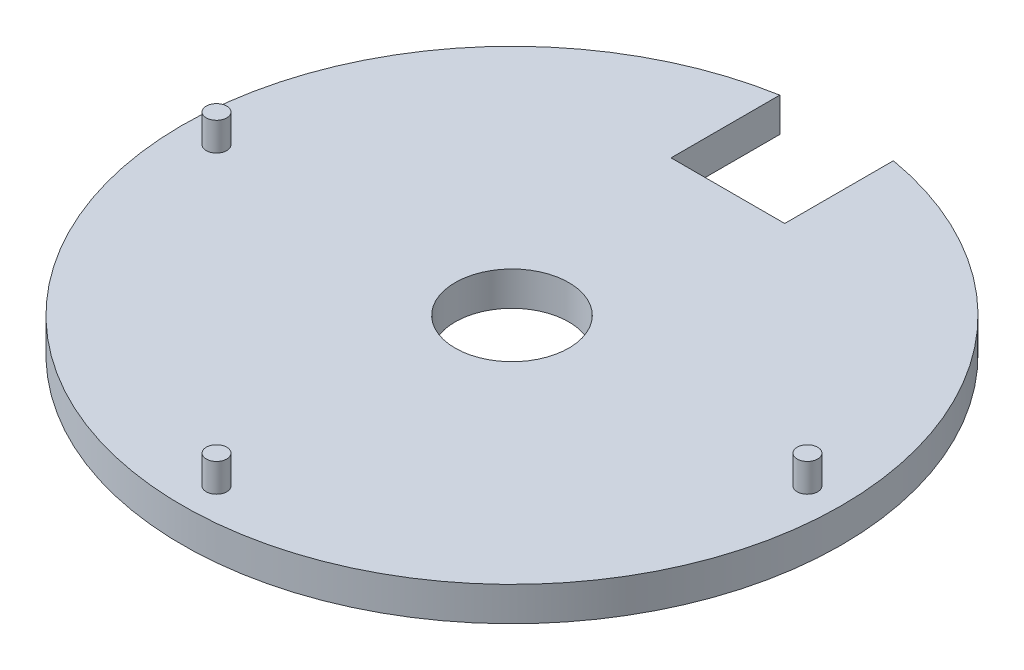
ISO-10303-21;
HEADER;
FILE_DESCRIPTION(('STEP AP214'),'2;1');
FILE_NAME('part.step','',(''),(''),'','','');
FILE_SCHEMA(('AUTOMOTIVE_DESIGN { 1 0 10303 214 1 1 1 1 }'));
ENDSEC;
DATA;
#1=APPLICATION_CONTEXT('core data for automotive mechanical design processes');
#2=APPLICATION_PROTOCOL_DEFINITION('international standard','automotive_design',2000,#1);
#3=PRODUCT_CONTEXT('',#1,'mechanical');
#4=PRODUCT('Part','Part','',(#3));
#5=PRODUCT_RELATED_PRODUCT_CATEGORY('part','',(#4));
#6=PRODUCT_DEFINITION_FORMATION('','',#4);
#7=PRODUCT_DEFINITION_CONTEXT('part definition',#1,'design');
#8=PRODUCT_DEFINITION('design','',#6,#7);
#9=PRODUCT_DEFINITION_SHAPE('','',#8);
#10=(LENGTH_UNIT() NAMED_UNIT(*) SI_UNIT(.MILLI.,.METRE.));
#11=(NAMED_UNIT(*) PLANE_ANGLE_UNIT() SI_UNIT($,.RADIAN.));
#12=(NAMED_UNIT(*) SI_UNIT($,.STERADIAN.) SOLID_ANGLE_UNIT());
#13=UNCERTAINTY_MEASURE_WITH_UNIT(LENGTH_MEASURE(1.E-05),#10,'distance_accuracy_value','');
#14=(GEOMETRIC_REPRESENTATION_CONTEXT(3) GLOBAL_UNCERTAINTY_ASSIGNED_CONTEXT((#13)) GLOBAL_UNIT_ASSIGNED_CONTEXT((#10,
#11,#12)) REPRESENTATION_CONTEXT('',''));
#15=CARTESIAN_POINT('',(0.,0.,0.));
#16=DIRECTION('',(0.,0.,1.));
#17=DIRECTION('',(1.,0.,0.));
#18=AXIS2_PLACEMENT_3D('',#15,#16,#17);
#19=CARTESIAN_POINT('',(0.,3.,0.));
#20=DIRECTION('',(0.,-1.,0.));
#21=DIRECTION('',(0.,0.,-1.));
#22=AXIS2_PLACEMENT_3D('',#19,#20,#21);
#23=CYLINDRICAL_SURFACE('',#22,29.);
#24=CARTESIAN_POINT('',(0.,0.,0.));
#25=DIRECTION('',(0.,1.,0.));
#26=DIRECTION('',(0.,0.,1.));
#27=AXIS2_PLACEMENT_3D('',#24,#25,#26);
#28=CIRCLE('',#27,29.);
#29=CARTESIAN_POINT('',(-5.,0.,-28.5657137141714));
#30=VERTEX_POINT('',#29);
#31=CARTESIAN_POINT('',(5.,0.,-28.5657137141714));
#32=VERTEX_POINT('',#31);
#33=EDGE_CURVE('E122',#30,#32,#28,.T.);
#34=ORIENTED_EDGE('',*,*,#33,.T.);
#35=DIRECTION('',(0.,-1.,0.));
#36=VECTOR('',#35,1.);
#37=CARTESIAN_POINT('',(5.,3.,-28.5657137141714));
#38=LINE('',#37,#36);
#39=CARTESIAN_POINT('',(5.,3.,-28.5657137141714));
#40=VERTEX_POINT('',#39);
#41=EDGE_CURVE('E57',#32,#40,#38,.F.);
#42=ORIENTED_EDGE('',*,*,#41,.T.);
#43=CARTESIAN_POINT('',(0.,3.,0.));
#44=DIRECTION('',(0.,1.,0.));
#45=DIRECTION('',(0.,0.,1.));
#46=AXIS2_PLACEMENT_3D('',#43,#44,#45);
#47=CIRCLE('',#46,29.);
#48=CARTESIAN_POINT('',(-5.,3.,-28.5657137141714));
#49=VERTEX_POINT('',#48);
#50=EDGE_CURVE('E125',#49,#40,#47,.T.);
#51=ORIENTED_EDGE('',*,*,#50,.F.);
#52=DIRECTION('',(0.,-1.,0.));
#53=VECTOR('',#52,1.);
#54=CARTESIAN_POINT('',(-5.,3.,-28.5657137141714));
#55=LINE('',#54,#53);
#56=EDGE_CURVE('E87',#49,#30,#55,.T.);
#57=ORIENTED_EDGE('',*,*,#56,.T.);
#58=EDGE_LOOP('',(#34,#42,#51,#57));
#59=FACE_BOUND('',#58,.T.);
#60=ADVANCED_FACE('F35',(#59),#23,.T.);
#61=CARTESIAN_POINT('',(0.,3.,0.));
#62=DIRECTION('',(0.,1.,0.));
#63=DIRECTION('',(0.,0.,1.));
#64=AXIS2_PLACEMENT_3D('',#61,#62,#63);
#65=PLANE('',#64);
#66=DIRECTION('',(0.,0.,-1.));
#67=VECTOR('',#66,1.);
#68=CARTESIAN_POINT('',(5.,3.,-29.));
#69=LINE('',#68,#67);
#70=CARTESIAN_POINT('',(5.,3.,-19.));
#71=VERTEX_POINT('',#70);
#72=EDGE_CURVE('E81',#71,#40,#69,.T.);
#73=ORIENTED_EDGE('',*,*,#72,.F.);
#74=DIRECTION('',(1.,0.,0.));
#75=VECTOR('',#74,1.);
#76=CARTESIAN_POINT('',(5.,3.,-19.));
#77=LINE('',#76,#75);
#78=CARTESIAN_POINT('',(-5.,3.,-19.));
#79=VERTEX_POINT('',#78);
#80=EDGE_CURVE('E76',#79,#71,#77,.T.);
#81=ORIENTED_EDGE('',*,*,#80,.F.);
#82=DIRECTION('',(0.,0.,1.));
#83=VECTOR('',#82,1.);
#84=CARTESIAN_POINT('',(-5.,3.,-19.));
#85=LINE('',#84,#83);
#86=EDGE_CURVE('E84',#49,#79,#85,.T.);
#87=ORIENTED_EDGE('',*,*,#86,.F.);
#88=ORIENTED_EDGE('',*,*,#50,.T.);
#89=EDGE_LOOP('',(#73,#81,#87,#88));
#90=FACE_BOUND('',#89,.T.);
#91=CARTESIAN_POINT('',(0.,3.,0.));
#92=DIRECTION('',(0.,1.,0.));
#93=DIRECTION('',(0.,0.,1.));
#94=AXIS2_PLACEMENT_3D('',#91,#92,#93);
#95=CIRCLE('',#94,5.);
#96=CARTESIAN_POINT('',(0.,3.,5.));
#97=VERTEX_POINT('',#96);
#98=EDGE_CURVE('E100',#97,#97,#95,.T.);
#99=ORIENTED_EDGE('',*,*,#98,.F.);
#100=EDGE_LOOP('',(#99));
#101=FACE_BOUND('',#100,.T.);
#102=CARTESIAN_POINT('',(0.,3.,26.));
#103=DIRECTION('',(0.,1.,0.));
#104=DIRECTION('',(0.,0.,1.));
#105=AXIS2_PLACEMENT_3D('',#102,#103,#104);
#106=CIRCLE('',#105,0.9);
#107=CARTESIAN_POINT('',(0.,3.,26.9));
#108=VERTEX_POINT('',#107);
#109=EDGE_CURVE('E104',#108,#108,#106,.T.);
#110=ORIENTED_EDGE('',*,*,#109,.F.);
#111=EDGE_LOOP('',(#110));
#112=FACE_BOUND('',#111,.T.);
#113=CARTESIAN_POINT('',(26.,3.,0.));
#114=DIRECTION('',(0.,1.,0.));
#115=DIRECTION('',(0.,0.,1.));
#116=AXIS2_PLACEMENT_3D('',#113,#114,#115);
#117=CIRCLE('',#116,0.9);
#118=CARTESIAN_POINT('',(26.,3.,0.9));
#119=VERTEX_POINT('',#118);
#120=EDGE_CURVE('E113',#119,#119,#117,.T.);
#121=ORIENTED_EDGE('',*,*,#120,.F.);
#122=EDGE_LOOP('',(#121));
#123=FACE_BOUND('',#122,.T.);
#124=CARTESIAN_POINT('',(-26.,3.,0.));
#125=DIRECTION('',(0.,1.,0.));
#126=DIRECTION('',(0.,0.,1.));
#127=AXIS2_PLACEMENT_3D('',#124,#125,#126);
#128=CIRCLE('',#127,0.9);
#129=CARTESIAN_POINT('',(-26.,3.,0.900000000000004));
#130=VERTEX_POINT('',#129);
#131=EDGE_CURVE('E116',#130,#130,#128,.T.);
#132=ORIENTED_EDGE('',*,*,#131,.F.);
#133=EDGE_LOOP('',(#132));
#134=FACE_BOUND('',#133,.T.);
#135=ADVANCED_FACE('F92',(#90,#101,#112,#123,#134),#65,.T.);
#136=CARTESIAN_POINT('',(0.,0.,0.));
#137=DIRECTION('',(0.,1.,0.));
#138=DIRECTION('',(0.,0.,1.));
#139=AXIS2_PLACEMENT_3D('',#136,#137,#138);
#140=PLANE('',#139);
#141=CARTESIAN_POINT('',(0.,0.,0.));
#142=DIRECTION('',(0.,1.,0.));
#143=DIRECTION('',(0.,0.,1.));
#144=AXIS2_PLACEMENT_3D('',#141,#142,#143);
#145=CIRCLE('',#144,5.);
#146=CARTESIAN_POINT('',(0.,0.,5.));
#147=VERTEX_POINT('',#146);
#148=EDGE_CURVE('E101',#147,#147,#145,.T.);
#149=ORIENTED_EDGE('',*,*,#148,.T.);
#150=EDGE_LOOP('',(#149));
#151=FACE_BOUND('',#150,.T.);
#152=DIRECTION('',(1.,0.,0.));
#153=VECTOR('',#152,1.);
#154=CARTESIAN_POINT('',(0.,0.,-19.));
#155=LINE('',#154,#153);
#156=CARTESIAN_POINT('',(-5.,0.,-19.));
#157=VERTEX_POINT('',#156);
#158=CARTESIAN_POINT('',(5.,0.,-19.));
#159=VERTEX_POINT('',#158);
#160=EDGE_CURVE('E42',#157,#159,#155,.T.);
#161=ORIENTED_EDGE('',*,*,#160,.T.);
#162=DIRECTION('',(0.,0.,-1.));
#163=VECTOR('',#162,1.);
#164=CARTESIAN_POINT('',(5.,0.,0.));
#165=LINE('',#164,#163);
#166=EDGE_CURVE('E11',#159,#32,#165,.T.);
#167=ORIENTED_EDGE('',*,*,#166,.T.);
#168=ORIENTED_EDGE('',*,*,#33,.F.);
#169=DIRECTION('',(0.,0.,1.));
#170=VECTOR('',#169,1.);
#171=CARTESIAN_POINT('',(-5.,0.,0.));
#172=LINE('',#171,#170);
#173=EDGE_CURVE('E127',#30,#157,#172,.T.);
#174=ORIENTED_EDGE('',*,*,#173,.T.);
#175=EDGE_LOOP('',(#161,#167,#168,#174));
#176=FACE_BOUND('',#175,.T.);
#177=ADVANCED_FACE('F131',(#151,#176),#140,.F.);
#178=CARTESIAN_POINT('',(-26.,5.5,0.));
#179=DIRECTION('',(0.,-1.,0.));
#180=DIRECTION('',(0.,0.,-1.));
#181=AXIS2_PLACEMENT_3D('',#178,#179,#180);
#182=CYLINDRICAL_SURFACE('',#181,0.9);
#183=CARTESIAN_POINT('',(-26.,5.5,0.));
#184=DIRECTION('',(0.,1.,0.));
#185=DIRECTION('',(0.,0.,1.));
#186=AXIS2_PLACEMENT_3D('',#183,#184,#185);
#187=CIRCLE('',#186,0.9);
#188=CARTESIAN_POINT('',(-26.,5.5,0.900000000000004));
#189=VERTEX_POINT('',#188);
#190=EDGE_CURVE('E119',#189,#189,#187,.T.);
#191=ORIENTED_EDGE('',*,*,#190,.F.);
#192=EDGE_LOOP('',(#191));
#193=FACE_BOUND('',#192,.T.);
#194=ORIENTED_EDGE('',*,*,#131,.T.);
#195=EDGE_LOOP('',(#194));
#196=FACE_BOUND('',#195,.T.);
#197=ADVANCED_FACE('F142',(#193,#196),#182,.T.);
#198=CARTESIAN_POINT('',(-26.,5.5,0.));
#199=DIRECTION('',(0.,1.,0.));
#200=DIRECTION('',(0.,0.,1.));
#201=AXIS2_PLACEMENT_3D('',#198,#199,#200);
#202=PLANE('',#201);
#203=ORIENTED_EDGE('',*,*,#190,.T.);
#204=EDGE_LOOP('',(#203));
#205=FACE_BOUND('',#204,.T.);
#206=ADVANCED_FACE('F147',(#205),#202,.T.);
#207=CARTESIAN_POINT('',(26.,5.5,0.));
#208=DIRECTION('',(0.,-1.,0.));
#209=DIRECTION('',(0.,0.,-1.));
#210=AXIS2_PLACEMENT_3D('',#207,#208,#209);
#211=CYLINDRICAL_SURFACE('',#210,0.9);
#212=CARTESIAN_POINT('',(26.,5.5,0.));
#213=DIRECTION('',(0.,1.,0.));
#214=DIRECTION('',(0.,0.,1.));
#215=AXIS2_PLACEMENT_3D('',#212,#213,#214);
#216=CIRCLE('',#215,0.9);
#217=CARTESIAN_POINT('',(26.,5.5,0.9));
#218=VERTEX_POINT('',#217);
#219=EDGE_CURVE('E110',#218,#218,#216,.T.);
#220=ORIENTED_EDGE('',*,*,#219,.F.);
#221=EDGE_LOOP('',(#220));
#222=FACE_BOUND('',#221,.T.);
#223=ORIENTED_EDGE('',*,*,#120,.T.);
#224=EDGE_LOOP('',(#223));
#225=FACE_BOUND('',#224,.T.);
#226=ADVANCED_FACE('F151',(#222,#225),#211,.T.);
#227=CARTESIAN_POINT('',(26.,5.5,0.));
#228=DIRECTION('',(0.,1.,0.));
#229=DIRECTION('',(0.,0.,1.));
#230=AXIS2_PLACEMENT_3D('',#227,#228,#229);
#231=PLANE('',#230);
#232=ORIENTED_EDGE('',*,*,#219,.T.);
#233=EDGE_LOOP('',(#232));
#234=FACE_BOUND('',#233,.T.);
#235=ADVANCED_FACE('F153',(#234),#231,.T.);
#236=CARTESIAN_POINT('',(0.,5.5,26.));
#237=DIRECTION('',(0.,-1.,0.));
#238=DIRECTION('',(0.,0.,-1.));
#239=AXIS2_PLACEMENT_3D('',#236,#237,#238);
#240=CYLINDRICAL_SURFACE('',#239,0.9);
#241=CARTESIAN_POINT('',(0.,5.5,26.));
#242=DIRECTION('',(0.,1.,0.));
#243=DIRECTION('',(0.,0.,1.));
#244=AXIS2_PLACEMENT_3D('',#241,#242,#243);
#245=CIRCLE('',#244,0.9);
#246=CARTESIAN_POINT('',(0.,5.5,26.9));
#247=VERTEX_POINT('',#246);
#248=EDGE_CURVE('E107',#247,#247,#245,.T.);
#249=ORIENTED_EDGE('',*,*,#248,.F.);
#250=EDGE_LOOP('',(#249));
#251=FACE_BOUND('',#250,.T.);
#252=ORIENTED_EDGE('',*,*,#109,.T.);
#253=EDGE_LOOP('',(#252));
#254=FACE_BOUND('',#253,.T.);
#255=ADVANCED_FACE('F156',(#251,#254),#240,.T.);
#256=CARTESIAN_POINT('',(0.,5.5,26.));
#257=DIRECTION('',(0.,1.,0.));
#258=DIRECTION('',(0.,0.,1.));
#259=AXIS2_PLACEMENT_3D('',#256,#257,#258);
#260=PLANE('',#259);
#261=ORIENTED_EDGE('',*,*,#248,.T.);
#262=EDGE_LOOP('',(#261));
#263=FACE_BOUND('',#262,.T.);
#264=ADVANCED_FACE('F163',(#263),#260,.T.);
#265=CARTESIAN_POINT('',(0.,0.,0.));
#266=DIRECTION('',(0.,1.,0.));
#267=DIRECTION('',(0.,0.,1.));
#268=AXIS2_PLACEMENT_3D('',#265,#266,#267);
#269=CYLINDRICAL_SURFACE('',#268,5.);
#270=ORIENTED_EDGE('',*,*,#148,.F.);
#271=EDGE_LOOP('',(#270));
#272=FACE_BOUND('',#271,.T.);
#273=ORIENTED_EDGE('',*,*,#98,.T.);
#274=EDGE_LOOP('',(#273));
#275=FACE_BOUND('',#274,.T.);
#276=ADVANCED_FACE('F167',(#272,#275),#269,.F.);
#277=CARTESIAN_POINT('',(5.,-7.,-29.));
#278=DIRECTION('',(1.,0.,0.));
#279=DIRECTION('',(0.,0.,-1.));
#280=AXIS2_PLACEMENT_3D('',#277,#278,#279);
#281=PLANE('',#280);
#282=ORIENTED_EDGE('',*,*,#166,.F.);
#283=DIRECTION('',(0.,1.,0.));
#284=VECTOR('',#283,1.);
#285=CARTESIAN_POINT('',(5.,-7.,-19.));
#286=LINE('',#285,#284);
#287=EDGE_CURVE('E80',#159,#71,#286,.T.);
#288=ORIENTED_EDGE('',*,*,#287,.T.);
#289=ORIENTED_EDGE('',*,*,#72,.T.);
#290=ORIENTED_EDGE('',*,*,#41,.F.);
#291=EDGE_LOOP('',(#282,#288,#289,#290));
#292=FACE_BOUND('',#291,.T.);
#293=ADVANCED_FACE('F171',(#292),#281,.F.);
#294=CARTESIAN_POINT('',(5.,-7.,-19.));
#295=DIRECTION('',(0.,0.,1.));
#296=DIRECTION('',(1.,0.,0.));
#297=AXIS2_PLACEMENT_3D('',#294,#295,#296);
#298=PLANE('',#297);
#299=DIRECTION('',(0.,1.,0.));
#300=VECTOR('',#299,1.);
#301=CARTESIAN_POINT('',(-5.,-7.,-19.));
#302=LINE('',#301,#300);
#303=EDGE_CURVE('E49',#157,#79,#302,.T.);
#304=ORIENTED_EDGE('',*,*,#303,.T.);
#305=ORIENTED_EDGE('',*,*,#80,.T.);
#306=ORIENTED_EDGE('',*,*,#287,.F.);
#307=ORIENTED_EDGE('',*,*,#160,.F.);
#308=EDGE_LOOP('',(#304,#305,#306,#307));
#309=FACE_BOUND('',#308,.T.);
#310=ADVANCED_FACE('F73',(#309),#298,.F.);
#311=CARTESIAN_POINT('',(-5.,-7.,-19.));
#312=DIRECTION('',(-1.,0.,0.));
#313=DIRECTION('',(0.,0.,1.));
#314=AXIS2_PLACEMENT_3D('',#311,#312,#313);
#315=PLANE('',#314);
#316=ORIENTED_EDGE('',*,*,#86,.T.);
#317=ORIENTED_EDGE('',*,*,#303,.F.);
#318=ORIENTED_EDGE('',*,*,#173,.F.);
#319=ORIENTED_EDGE('',*,*,#56,.F.);
#320=EDGE_LOOP('',(#316,#317,#318,#319));
#321=FACE_BOUND('',#320,.T.);
#322=ADVANCED_FACE('F85',(#321),#315,.F.);
#323=CLOSED_SHELL('',(#60,#135,#177,#197,#206,#226,#235,#255,#264,#276,#293,#310,#322));
#324=MANIFOLD_SOLID_BREP('B2',#323);
#325=ADVANCED_BREP_SHAPE_REPRESENTATION('',(#18,#324),#14);
#326=SHAPE_DEFINITION_REPRESENTATION(#9,#325);
ENDSEC;
END-ISO-10303-21;
